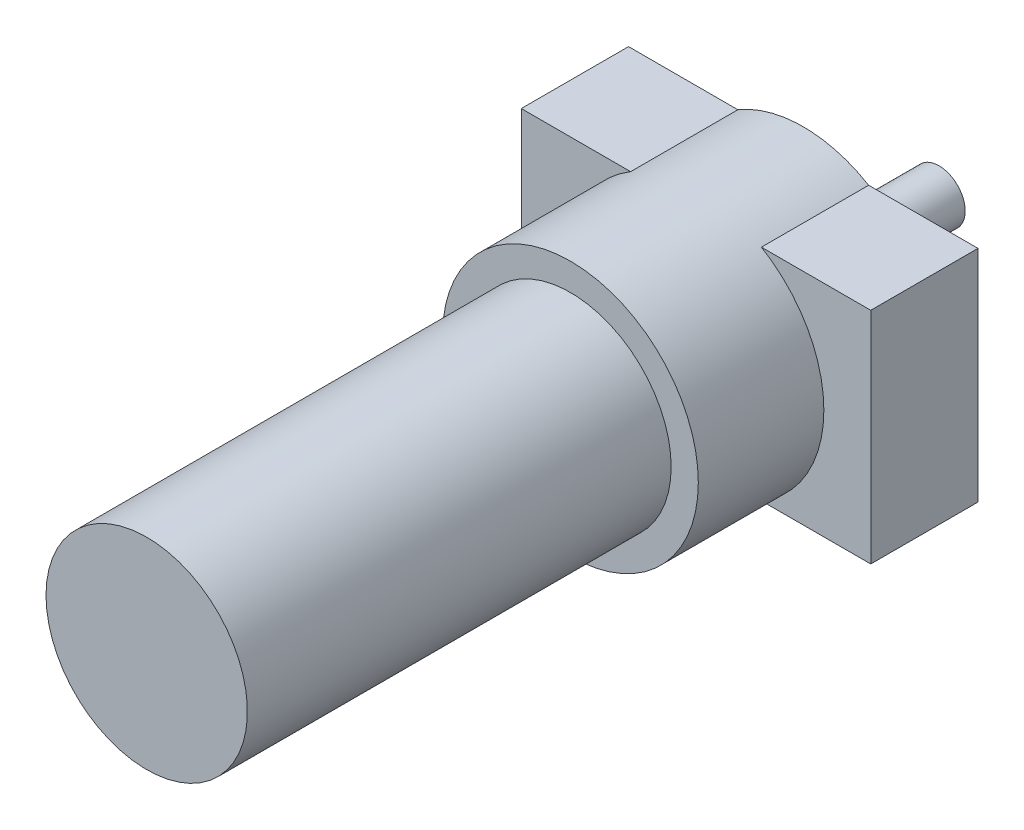
ISO-10303-21;
HEADER;
FILE_DESCRIPTION(('STEP AP214'),'2;1');
FILE_NAME('part.step','',(''),(''),'','','');
FILE_SCHEMA(('AUTOMOTIVE_DESIGN { 1 0 10303 214 1 1 1 1 }'));
ENDSEC;
DATA;
#1=APPLICATION_CONTEXT('core data for automotive mechanical design processes');
#2=APPLICATION_PROTOCOL_DEFINITION('international standard','automotive_design',2000,#1);
#3=PRODUCT_CONTEXT('',#1,'mechanical');
#4=PRODUCT('Part','Part','',(#3));
#5=PRODUCT_RELATED_PRODUCT_CATEGORY('part','',(#4));
#6=PRODUCT_DEFINITION_FORMATION('','',#4);
#7=PRODUCT_DEFINITION_CONTEXT('part definition',#1,'design');
#8=PRODUCT_DEFINITION('design','',#6,#7);
#9=PRODUCT_DEFINITION_SHAPE('','',#8);
#10=(LENGTH_UNIT() NAMED_UNIT(*) SI_UNIT(.MILLI.,.METRE.));
#11=(NAMED_UNIT(*) PLANE_ANGLE_UNIT() SI_UNIT($,.RADIAN.));
#12=(NAMED_UNIT(*) SI_UNIT($,.STERADIAN.) SOLID_ANGLE_UNIT());
#13=UNCERTAINTY_MEASURE_WITH_UNIT(LENGTH_MEASURE(1.E-05),#10,'distance_accuracy_value','');
#14=(GEOMETRIC_REPRESENTATION_CONTEXT(3) GLOBAL_UNCERTAINTY_ASSIGNED_CONTEXT((#13)) GLOBAL_UNIT_ASSIGNED_CONTEXT((#10,
#11,#12)) REPRESENTATION_CONTEXT('',''));
#15=CARTESIAN_POINT('',(0.,0.,0.));
#16=DIRECTION('',(0.,0.,1.));
#17=DIRECTION('',(1.,0.,0.));
#18=AXIS2_PLACEMENT_3D('',#15,#16,#17);
#19=CARTESIAN_POINT('',(0.,0.,51.9));
#20=DIRECTION('',(0.,0.,-1.));
#21=DIRECTION('',(-1.,0.,0.));
#22=AXIS2_PLACEMENT_3D('',#19,#20,#21);
#23=CYLINDRICAL_SURFACE('',#22,10.);
#24=CARTESIAN_POINT('',(0.,0.,51.9));
#25=DIRECTION('',(0.,0.,1.));
#26=DIRECTION('',(1.,0.,0.));
#27=AXIS2_PLACEMENT_3D('',#24,#25,#26);
#28=CIRCLE('',#27,10.);
#29=CARTESIAN_POINT('',(-10.,0.,51.9));
#30=VERTEX_POINT('',#29);
#31=EDGE_CURVE('E194',#30,#30,#28,.T.);
#32=CARTESIAN_POINT('',(0.,0.,0.));
#33=DIRECTION('',(0.,0.,1.));
#34=DIRECTION('',(1.,0.,0.));
#35=AXIS2_PLACEMENT_3D('',#32,#33,#34);
#36=CIRCLE('',#35,10.);
#37=CARTESIAN_POINT('',(-10.,0.,0.));
#38=VERTEX_POINT('',#37);
#39=EDGE_CURVE('E190',#38,#38,#36,.T.);
#40=CARTESIAN_POINT('',(-10.,0.,51.9));
#41=CARTESIAN_POINT('',(-10.,0.,51.359375));
#42=CARTESIAN_POINT('',(-10.,0.,50.81875));
#43=CARTESIAN_POINT('',(-10.,0.,49.7375));
#44=CARTESIAN_POINT('',(-10.,0.,49.196875));
#45=CARTESIAN_POINT('',(-10.,0.,48.115625));
#46=CARTESIAN_POINT('',(-10.,0.,47.575));
#47=CARTESIAN_POINT('',(-10.,0.,46.49375));
#48=CARTESIAN_POINT('',(-10.,0.,45.953125));
#49=CARTESIAN_POINT('',(-10.,0.,44.871875));
#50=CARTESIAN_POINT('',(-10.,0.,44.33125));
#51=CARTESIAN_POINT('',(-10.,0.,43.25));
#52=CARTESIAN_POINT('',(-10.,0.,42.709375));
#53=CARTESIAN_POINT('',(-10.,0.,41.628125));
#54=CARTESIAN_POINT('',(-10.,0.,41.0875));
#55=CARTESIAN_POINT('',(-10.,0.,40.00625));
#56=CARTESIAN_POINT('',(-10.,0.,39.465625));
#57=CARTESIAN_POINT('',(-10.,0.,38.384375));
#58=CARTESIAN_POINT('',(-10.,0.,37.84375));
#59=CARTESIAN_POINT('',(-10.,0.,36.7625));
#60=CARTESIAN_POINT('',(-10.,0.,36.221875));
#61=CARTESIAN_POINT('',(-10.,0.,35.140625));
#62=CARTESIAN_POINT('',(-10.,0.,34.6));
#63=CARTESIAN_POINT('',(-10.,0.,33.51875));
#64=CARTESIAN_POINT('',(-10.,0.,32.978125));
#65=CARTESIAN_POINT('',(-10.,0.,31.896875));
#66=CARTESIAN_POINT('',(-10.,0.,31.35625));
#67=CARTESIAN_POINT('',(-10.,0.,30.275));
#68=CARTESIAN_POINT('',(-10.,0.,29.734375));
#69=CARTESIAN_POINT('',(-10.,0.,28.653125));
#70=CARTESIAN_POINT('',(-10.,0.,28.1125));
#71=CARTESIAN_POINT('',(-10.,0.,27.03125));
#72=CARTESIAN_POINT('',(-10.,0.,26.490625));
#73=CARTESIAN_POINT('',(-10.,0.,25.409375));
#74=CARTESIAN_POINT('',(-10.,0.,24.86875));
#75=CARTESIAN_POINT('',(-10.,0.,23.7875));
#76=CARTESIAN_POINT('',(-10.,0.,23.246875));
#77=CARTESIAN_POINT('',(-10.,0.,22.165625));
#78=CARTESIAN_POINT('',(-10.,0.,21.625));
#79=CARTESIAN_POINT('',(-10.,0.,20.54375));
#80=CARTESIAN_POINT('',(-10.,0.,20.003125));
#81=CARTESIAN_POINT('',(-10.,0.,18.921875));
#82=CARTESIAN_POINT('',(-10.,0.,18.38125));
#83=CARTESIAN_POINT('',(-10.,0.,17.3));
#84=CARTESIAN_POINT('',(-10.,0.,16.759375));
#85=CARTESIAN_POINT('',(-10.,0.,15.678125));
#86=CARTESIAN_POINT('',(-10.,0.,15.1375));
#87=CARTESIAN_POINT('',(-10.,0.,14.05625));
#88=CARTESIAN_POINT('',(-10.,0.,13.515625));
#89=CARTESIAN_POINT('',(-10.,0.,12.434375));
#90=CARTESIAN_POINT('',(-10.,0.,11.89375));
#91=CARTESIAN_POINT('',(-10.,0.,10.8125));
#92=CARTESIAN_POINT('',(-10.,0.,10.271875));
#93=CARTESIAN_POINT('',(-10.,0.,9.190625));
#94=CARTESIAN_POINT('',(-10.,0.,8.65));
#95=CARTESIAN_POINT('',(-10.,0.,7.56874999999999));
#96=CARTESIAN_POINT('',(-10.,0.,7.02812499999999));
#97=CARTESIAN_POINT('',(-10.,0.,5.94687499999999));
#98=CARTESIAN_POINT('',(-10.,0.,5.40624999999999));
#99=CARTESIAN_POINT('',(-10.,0.,4.32499999999999));
#100=CARTESIAN_POINT('',(-10.,0.,3.78437499999999));
#101=CARTESIAN_POINT('',(-10.,0.,2.703125));
#102=CARTESIAN_POINT('',(-10.,0.,2.1625));
#103=CARTESIAN_POINT('',(-10.,0.,1.08124999999999));
#104=CARTESIAN_POINT('',(-10.,0.,0.540624999999994));
#105=CARTESIAN_POINT('',(-10.,0.,0.));
#106=B_SPLINE_CURVE_WITH_KNOTS('',3,(#40,#41,#42,#43,#44,#45,#46,#47,#48,#49,#50,#51,#52,#53,
#54,#55,#56,#57,#58,#59,#60,#61,#62,#63,#64,#65,#66,#67,#68,#69,#70,#71,#72,#73,#74,#75,#76,#77,
#78,#79,#80,#81,#82,#83,#84,#85,#86,#87,#88,#89,#90,#91,#92,#93,#94,#95,#96,#97,#98,#99,#100,
#101,#102,#103,#104,#105),.UNSPECIFIED.,.F.,.F.,(4,2,2,2,2,2,2,2,2,2,2,2,2,2,2,2,2,2,2,2,2,2,2,
2,2,2,2,2,2,2,2,2,4),(0.,1.62187499999999,3.24375,4.865625,6.4875,8.10937499999999,9.73125,
11.353125,12.975,14.596875,16.21875,17.840625,19.4625,21.084375,22.70625,24.328125,25.95,
27.571875,29.19375,30.815625,32.4375,34.059375,35.68125,37.303125,38.925,40.546875,42.16875,
43.790625,45.4125,47.034375,48.65625,50.278125,51.9),.UNSPECIFIED.);
#107=EDGE_CURVE('BSEAM45',#30,#38,#106,.T.);
#108=ORIENTED_EDGE('',*,*,#31,.F.);
#109=ORIENTED_EDGE('',*,*,#39,.T.);
#110=ORIENTED_EDGE('',*,*,#107,.T.);
#111=ORIENTED_EDGE('',*,*,#107,.F.);
#112=EDGE_LOOP('',(#108,#110,#109,#111));
#113=FACE_BOUND('',#112,.T.);
#114=ADVANCED_FACE('F45',(#113),#23,.T.);
#115=CARTESIAN_POINT('',(0.,0.,0.));
#116=DIRECTION('',(0.,0.,1.));
#117=DIRECTION('',(1.,0.,0.));
#118=AXIS2_PLACEMENT_3D('',#115,#116,#117);
#119=PLANE('',#118);
#120=ORIENTED_EDGE('',*,*,#39,.F.);
#121=EDGE_LOOP('',(#120));
#122=FACE_BOUND('',#121,.T.);
#123=ADVANCED_FACE('F202',(#122),#119,.F.);
#124=CARTESIAN_POINT('',(0.,0.,140.9));
#125=DIRECTION('',(0.,0.,-1.));
#126=DIRECTION('',(-1.,0.,0.));
#127=AXIS2_PLACEMENT_3D('',#124,#125,#126);
#128=CYLINDRICAL_SURFACE('',#127,48.8773976393998);
#129=CARTESIAN_POINT('',(0.,0.,92.9));
#130=DIRECTION('',(0.,0.,1.));
#131=DIRECTION('',(1.,0.,0.));
#132=AXIS2_PLACEMENT_3D('',#129,#130,#131);
#133=CIRCLE('',#132,48.8773976393998);
#134=CARTESIAN_POINT('',(-25.,42.,92.9));
#135=VERTEX_POINT('',#134);
#136=CARTESIAN_POINT('',(-25.0000000000001,-42.,92.9));
#137=VERTEX_POINT('',#136);
#138=EDGE_CURVE('E54',#135,#137,#133,.T.);
#139=ORIENTED_EDGE('',*,*,#138,.T.);
#140=DIRECTION('',(0.,0.,-1.));
#141=VECTOR('',#140,1.);
#142=CARTESIAN_POINT('',(-25.0000000000001,-42.,140.9));
#143=LINE('',#142,#141);
#144=CARTESIAN_POINT('',(-25.,-42.,51.9));
#145=VERTEX_POINT('',#144);
#146=EDGE_CURVE('E182',#137,#145,#143,.T.);
#147=ORIENTED_EDGE('',*,*,#146,.T.);
#148=CARTESIAN_POINT('',(0.,0.,51.9));
#149=DIRECTION('',(0.,0.,1.));
#150=DIRECTION('',(1.,0.,0.));
#151=AXIS2_PLACEMENT_3D('',#148,#149,#150);
#152=CIRCLE('',#151,48.8773976393998);
#153=CARTESIAN_POINT('',(25.,-42.,51.9));
#154=VERTEX_POINT('',#153);
#155=EDGE_CURVE('E185',#145,#154,#152,.T.);
#156=ORIENTED_EDGE('',*,*,#155,.T.);
#157=DIRECTION('',(0.,0.,-1.));
#158=VECTOR('',#157,1.);
#159=CARTESIAN_POINT('',(25.,-42.,140.9));
#160=LINE('',#159,#158);
#161=CARTESIAN_POINT('',(25.,-42.,92.9));
#162=VERTEX_POINT('',#161);
#163=EDGE_CURVE('E179',#154,#162,#160,.F.);
#164=ORIENTED_EDGE('',*,*,#163,.T.);
#165=CARTESIAN_POINT('',(25.,42.,92.9));
#166=VERTEX_POINT('',#165);
#167=EDGE_CURVE('E48',#162,#166,#133,.T.);
#168=ORIENTED_EDGE('',*,*,#167,.T.);
#169=DIRECTION('',(0.,0.,-1.));
#170=VECTOR('',#169,1.);
#171=CARTESIAN_POINT('',(25.,42.,140.9));
#172=LINE('',#171,#170);
#173=CARTESIAN_POINT('',(25.,42.,51.9));
#174=VERTEX_POINT('',#173);
#175=EDGE_CURVE('E175',#166,#174,#172,.T.);
#176=ORIENTED_EDGE('',*,*,#175,.T.);
#177=CARTESIAN_POINT('',(-25.,42.,51.9));
#178=VERTEX_POINT('',#177);
#179=EDGE_CURVE('E191',#174,#178,#152,.T.);
#180=ORIENTED_EDGE('',*,*,#179,.T.);
#181=DIRECTION('',(0.,0.,-1.));
#182=VECTOR('',#181,1.);
#183=CARTESIAN_POINT('',(-25.,42.,140.9));
#184=LINE('',#183,#182);
#185=EDGE_CURVE('E66',#178,#135,#184,.F.);
#186=ORIENTED_EDGE('',*,*,#185,.T.);
#187=EDGE_LOOP('',(#139,#147,#156,#164,#168,#176,#180,#186));
#188=FACE_BOUND('',#187,.T.);
#189=CARTESIAN_POINT('',(0.,0.,140.9));
#190=DIRECTION('',(0.,0.,1.));
#191=DIRECTION('',(1.,0.,0.));
#192=AXIS2_PLACEMENT_3D('',#189,#190,#191);
#193=CIRCLE('',#192,48.8773976393998);
#194=CARTESIAN_POINT('',(48.8773976393997,0.,140.9));
#195=VERTEX_POINT('',#194);
#196=EDGE_CURVE('E186',#195,#195,#193,.T.);
#197=ORIENTED_EDGE('',*,*,#196,.F.);
#198=EDGE_LOOP('',(#197));
#199=FACE_BOUND('',#198,.T.);
#200=ADVANCED_FACE('F204',(#188,#199),#128,.T.);
#201=CARTESIAN_POINT('',(0.,0.,140.9));
#202=DIRECTION('',(0.,0.,1.));
#203=DIRECTION('',(1.,0.,0.));
#204=AXIS2_PLACEMENT_3D('',#201,#202,#203);
#205=PLANE('',#204);
#206=CARTESIAN_POINT('',(0.,0.,140.9));
#207=DIRECTION('',(0.,0.,1.));
#208=DIRECTION('',(1.,0.,0.));
#209=AXIS2_PLACEMENT_3D('',#206,#207,#208);
#210=CIRCLE('',#209,38.5);
#211=CARTESIAN_POINT('',(38.5,0.,140.9));
#212=VERTEX_POINT('',#211);
#213=EDGE_CURVE('E11',#212,#212,#210,.T.);
#214=ORIENTED_EDGE('',*,*,#213,.F.);
#215=EDGE_LOOP('',(#214));
#216=FACE_BOUND('',#215,.T.);
#217=ORIENTED_EDGE('',*,*,#196,.T.);
#218=EDGE_LOOP('',(#217));
#219=FACE_BOUND('',#218,.T.);
#220=ADVANCED_FACE('F209',(#216,#219),#205,.T.);
#221=CARTESIAN_POINT('',(0.,0.,51.9));
#222=DIRECTION('',(0.,0.,1.));
#223=DIRECTION('',(1.,0.,0.));
#224=AXIS2_PLACEMENT_3D('',#221,#222,#223);
#225=PLANE('',#224);
#226=ORIENTED_EDGE('',*,*,#179,.F.);
#227=DIRECTION('',(1.,0.,0.));
#228=VECTOR('',#227,1.);
#229=CARTESIAN_POINT('',(66.8,42.,51.9));
#230=LINE('',#229,#228);
#231=CARTESIAN_POINT('',(66.8,42.,51.9));
#232=VERTEX_POINT('',#231);
#233=EDGE_CURVE('E157',#174,#232,#230,.T.);
#234=ORIENTED_EDGE('',*,*,#233,.T.);
#235=DIRECTION('',(0.,-1.,0.));
#236=VECTOR('',#235,1.);
#237=CARTESIAN_POINT('',(66.8,-42.,51.9));
#238=LINE('',#237,#236);
#239=CARTESIAN_POINT('',(66.8,-42.,51.9));
#240=VERTEX_POINT('',#239);
#241=EDGE_CURVE('E161',#232,#240,#238,.T.);
#242=ORIENTED_EDGE('',*,*,#241,.T.);
#243=DIRECTION('',(-1.,0.,0.));
#244=VECTOR('',#243,1.);
#245=CARTESIAN_POINT('',(66.8,-42.,51.9));
#246=LINE('',#245,#244);
#247=EDGE_CURVE('E138',#240,#154,#246,.T.);
#248=ORIENTED_EDGE('',*,*,#247,.T.);
#249=ORIENTED_EDGE('',*,*,#155,.F.);
#250=CARTESIAN_POINT('',(-66.8,-42.,51.9));
#251=VERTEX_POINT('',#250);
#252=EDGE_CURVE('E143',#145,#251,#246,.T.);
#253=ORIENTED_EDGE('',*,*,#252,.T.);
#254=DIRECTION('',(0.,1.,0.));
#255=VECTOR('',#254,1.);
#256=CARTESIAN_POINT('',(-66.8,-42.,51.9));
#257=LINE('',#256,#255);
#258=CARTESIAN_POINT('',(-66.8,42.,51.9));
#259=VERTEX_POINT('',#258);
#260=EDGE_CURVE('E154',#251,#259,#257,.T.);
#261=ORIENTED_EDGE('',*,*,#260,.T.);
#262=EDGE_CURVE('E115',#259,#178,#230,.T.);
#263=ORIENTED_EDGE('',*,*,#262,.T.);
#264=EDGE_LOOP('',(#226,#234,#242,#248,#249,#253,#261,#263));
#265=FACE_BOUND('',#264,.T.);
#266=ORIENTED_EDGE('',*,*,#31,.T.);
#267=EDGE_LOOP('',(#266));
#268=FACE_BOUND('',#267,.T.);
#269=ADVANCED_FACE('F213',(#265,#268),#225,.F.);
#270=CARTESIAN_POINT('',(66.8,-42.,92.9));
#271=DIRECTION('',(1.,0.,0.));
#272=DIRECTION('',(0.,0.,-1.));
#273=AXIS2_PLACEMENT_3D('',#270,#271,#272);
#274=PLANE('',#273);
#275=ORIENTED_EDGE('',*,*,#241,.F.);
#276=DIRECTION('',(0.,0.,-1.));
#277=VECTOR('',#276,1.);
#278=CARTESIAN_POINT('',(66.8,42.,92.9));
#279=LINE('',#278,#277);
#280=CARTESIAN_POINT('',(66.8,42.,92.9));
#281=VERTEX_POINT('',#280);
#282=EDGE_CURVE('E121',#281,#232,#279,.T.);
#283=ORIENTED_EDGE('',*,*,#282,.F.);
#284=DIRECTION('',(0.,-1.,0.));
#285=VECTOR('',#284,1.);
#286=CARTESIAN_POINT('',(66.8,-42.,92.9));
#287=LINE('',#286,#285);
#288=CARTESIAN_POINT('',(66.8,-42.,92.9));
#289=VERTEX_POINT('',#288);
#290=EDGE_CURVE('E130',#281,#289,#287,.T.);
#291=ORIENTED_EDGE('',*,*,#290,.T.);
#292=DIRECTION('',(0.,0.,-1.));
#293=VECTOR('',#292,1.);
#294=CARTESIAN_POINT('',(66.8,-42.,92.9));
#295=LINE('',#294,#293);
#296=EDGE_CURVE('E167',#289,#240,#295,.T.);
#297=ORIENTED_EDGE('',*,*,#296,.T.);
#298=EDGE_LOOP('',(#275,#283,#291,#297));
#299=FACE_BOUND('',#298,.T.);
#300=ADVANCED_FACE('F216',(#299),#274,.T.);
#301=CARTESIAN_POINT('',(0.,0.,92.9));
#302=DIRECTION('',(0.,0.,1.));
#303=DIRECTION('',(1.,0.,0.));
#304=AXIS2_PLACEMENT_3D('',#301,#302,#303);
#305=PLANE('',#304);
#306=ORIENTED_EDGE('',*,*,#167,.F.);
#307=DIRECTION('',(-1.,0.,0.));
#308=VECTOR('',#307,1.);
#309=CARTESIAN_POINT('',(66.8,-42.,92.9));
#310=LINE('',#309,#308);
#311=EDGE_CURVE('E122',#289,#162,#310,.T.);
#312=ORIENTED_EDGE('',*,*,#311,.F.);
#313=ORIENTED_EDGE('',*,*,#290,.F.);
#314=DIRECTION('',(1.,0.,0.));
#315=VECTOR('',#314,1.);
#316=CARTESIAN_POINT('',(66.8,42.,92.9));
#317=LINE('',#316,#315);
#318=EDGE_CURVE('E131',#166,#281,#317,.T.);
#319=ORIENTED_EDGE('',*,*,#318,.F.);
#320=EDGE_LOOP('',(#306,#312,#313,#319));
#321=FACE_BOUND('',#320,.T.);
#322=ADVANCED_FACE('F228',(#321),#305,.T.);
#323=CARTESIAN_POINT('',(66.8,42.,92.9));
#324=DIRECTION('',(0.,1.,0.));
#325=DIRECTION('',(0.,0.,1.));
#326=AXIS2_PLACEMENT_3D('',#323,#324,#325);
#327=PLANE('',#326);
#328=ORIENTED_EDGE('',*,*,#175,.F.);
#329=ORIENTED_EDGE('',*,*,#318,.T.);
#330=ORIENTED_EDGE('',*,*,#282,.T.);
#331=ORIENTED_EDGE('',*,*,#233,.F.);
#332=EDGE_LOOP('',(#328,#329,#330,#331));
#333=FACE_BOUND('',#332,.T.);
#334=ADVANCED_FACE('F224',(#333),#327,.T.);
#335=CARTESIAN_POINT('',(66.8,-42.,92.9));
#336=DIRECTION('',(0.,-1.,0.));
#337=DIRECTION('',(0.,0.,-1.));
#338=AXIS2_PLACEMENT_3D('',#335,#336,#337);
#339=PLANE('',#338);
#340=ORIENTED_EDGE('',*,*,#163,.F.);
#341=ORIENTED_EDGE('',*,*,#247,.F.);
#342=ORIENTED_EDGE('',*,*,#296,.F.);
#343=ORIENTED_EDGE('',*,*,#311,.T.);
#344=EDGE_LOOP('',(#340,#341,#342,#343));
#345=FACE_BOUND('',#344,.T.);
#346=ADVANCED_FACE('F227',(#345),#339,.T.);
#347=ORIENTED_EDGE('',*,*,#138,.F.);
#348=CARTESIAN_POINT('',(-66.8,42.,92.9));
#349=VERTEX_POINT('',#348);
#350=EDGE_CURVE('E113',#349,#135,#317,.T.);
#351=ORIENTED_EDGE('',*,*,#350,.F.);
#352=DIRECTION('',(0.,1.,0.));
#353=VECTOR('',#352,1.);
#354=CARTESIAN_POINT('',(-66.8,-42.,92.9));
#355=LINE('',#354,#353);
#356=CARTESIAN_POINT('',(-66.8,-42.,92.9));
#357=VERTEX_POINT('',#356);
#358=EDGE_CURVE('E128',#357,#349,#355,.T.);
#359=ORIENTED_EDGE('',*,*,#358,.F.);
#360=EDGE_CURVE('E150',#137,#357,#310,.T.);
#361=ORIENTED_EDGE('',*,*,#360,.F.);
#362=EDGE_LOOP('',(#347,#351,#359,#361));
#363=FACE_BOUND('',#362,.T.);
#364=ADVANCED_FACE('F126',(#363),#305,.T.);
#365=ORIENTED_EDGE('',*,*,#146,.F.);
#366=ORIENTED_EDGE('',*,*,#360,.T.);
#367=DIRECTION('',(0.,0.,-1.));
#368=VECTOR('',#367,1.);
#369=CARTESIAN_POINT('',(-66.8,-42.,92.9));
#370=LINE('',#369,#368);
#371=EDGE_CURVE('E136',#357,#251,#370,.T.);
#372=ORIENTED_EDGE('',*,*,#371,.T.);
#373=ORIENTED_EDGE('',*,*,#252,.F.);
#374=EDGE_LOOP('',(#365,#366,#372,#373));
#375=FACE_BOUND('',#374,.T.);
#376=ADVANCED_FACE('F233',(#375),#339,.T.);
#377=ORIENTED_EDGE('',*,*,#185,.F.);
#378=ORIENTED_EDGE('',*,*,#262,.F.);
#379=DIRECTION('',(0.,0.,-1.));
#380=VECTOR('',#379,1.);
#381=CARTESIAN_POINT('',(-66.8,42.,92.9));
#382=LINE('',#381,#380);
#383=EDGE_CURVE('E110',#349,#259,#382,.T.);
#384=ORIENTED_EDGE('',*,*,#383,.F.);
#385=ORIENTED_EDGE('',*,*,#350,.T.);
#386=EDGE_LOOP('',(#377,#378,#384,#385));
#387=FACE_BOUND('',#386,.T.);
#388=ADVANCED_FACE('F112',(#387),#327,.T.);
#389=CARTESIAN_POINT('',(-66.8,-42.,92.9));
#390=DIRECTION('',(-1.,0.,0.));
#391=DIRECTION('',(0.,0.,1.));
#392=AXIS2_PLACEMENT_3D('',#389,#390,#391);
#393=PLANE('',#392);
#394=ORIENTED_EDGE('',*,*,#260,.F.);
#395=ORIENTED_EDGE('',*,*,#371,.F.);
#396=ORIENTED_EDGE('',*,*,#358,.T.);
#397=ORIENTED_EDGE('',*,*,#383,.T.);
#398=EDGE_LOOP('',(#394,#395,#396,#397));
#399=FACE_BOUND('',#398,.T.);
#400=ADVANCED_FACE('F134',(#399),#393,.T.);
#401=CARTESIAN_POINT('',(0.,0.,302.9));
#402=DIRECTION('',(0.,0.,-1.));
#403=DIRECTION('',(-1.,0.,0.));
#404=AXIS2_PLACEMENT_3D('',#401,#402,#403);
#405=CYLINDRICAL_SURFACE('',#404,38.5);
#406=ORIENTED_EDGE('',*,*,#213,.T.);
#407=EDGE_LOOP('',(#406));
#408=FACE_BOUND('',#407,.T.);
#409=CARTESIAN_POINT('',(0.,0.,302.9));
#410=DIRECTION('',(0.,0.,-1.));
#411=DIRECTION('',(-1.,0.,0.));
#412=AXIS2_PLACEMENT_3D('',#409,#410,#411);
#413=CIRCLE('',#412,38.5);
#414=CARTESIAN_POINT('',(-38.5,0.,302.9));
#415=VERTEX_POINT('',#414);
#416=EDGE_CURVE('E158',#415,#415,#413,.T.);
#417=ORIENTED_EDGE('',*,*,#416,.T.);
#418=EDGE_LOOP('',(#417));
#419=FACE_BOUND('',#418,.T.);
#420=ADVANCED_FACE('F223',(#408,#419),#405,.T.);
#421=CARTESIAN_POINT('',(0.,0.,302.9));
#422=DIRECTION('',(0.,0.,-1.));
#423=DIRECTION('',(-1.,0.,0.));
#424=AXIS2_PLACEMENT_3D('',#421,#422,#423);
#425=PLANE('',#424);
#426=ORIENTED_EDGE('',*,*,#416,.F.);
#427=EDGE_LOOP('',(#426));
#428=FACE_BOUND('',#427,.T.);
#429=ADVANCED_FACE('F242',(#428),#425,.F.);
#430=CLOSED_SHELL('',(#114,#123,#200,#220,#269,#300,#322,#334,#346,#364,#376,#388,#400,#420,#429));
#431=MANIFOLD_SOLID_BREP('B2',#430);
#432=ADVANCED_BREP_SHAPE_REPRESENTATION('',(#18,#431),#14);
#433=SHAPE_DEFINITION_REPRESENTATION(#9,#432);
ENDSEC;
END-ISO-10303-21;
